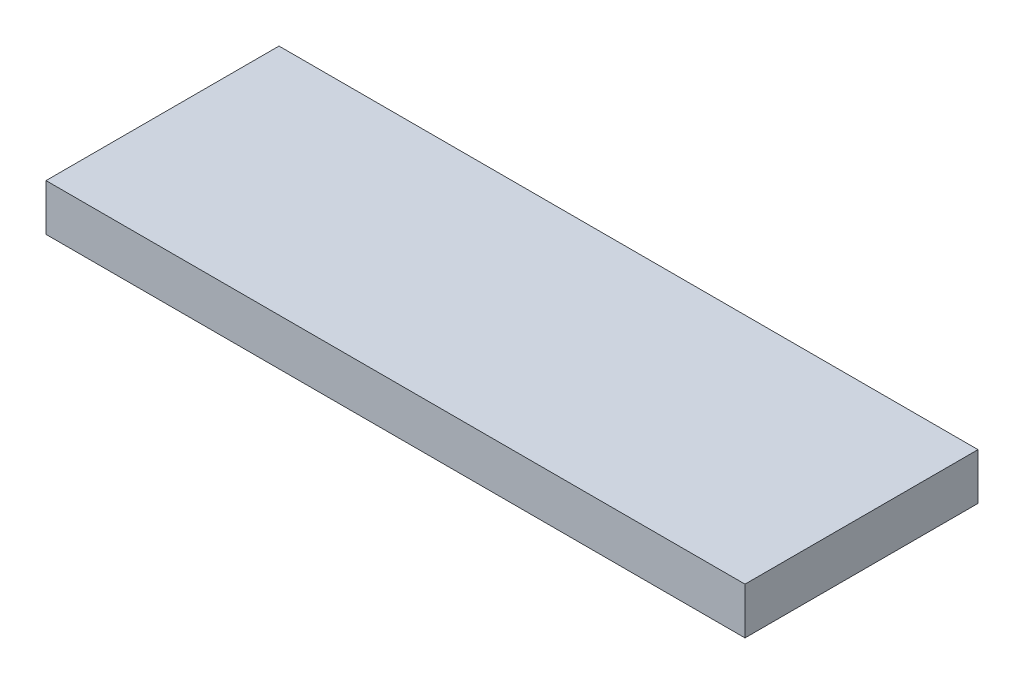
ISO-10303-21;
HEADER;
FILE_DESCRIPTION(('STEP AP214'),'2;1');
FILE_NAME('part.step','',(''),(''),'','','');
FILE_SCHEMA(('AUTOMOTIVE_DESIGN { 1 0 10303 214 1 1 1 1 }'));
ENDSEC;
DATA;
#1=APPLICATION_CONTEXT('core data for automotive mechanical design processes');
#2=APPLICATION_PROTOCOL_DEFINITION('international standard','automotive_design',2000,#1);
#3=PRODUCT_CONTEXT('',#1,'mechanical');
#4=PRODUCT('Part','Part','',(#3));
#5=PRODUCT_RELATED_PRODUCT_CATEGORY('part','',(#4));
#6=PRODUCT_DEFINITION_FORMATION('','',#4);
#7=PRODUCT_DEFINITION_CONTEXT('part definition',#1,'design');
#8=PRODUCT_DEFINITION('design','',#6,#7);
#9=PRODUCT_DEFINITION_SHAPE('','',#8);
#10=(LENGTH_UNIT() NAMED_UNIT(*) SI_UNIT(.MILLI.,.METRE.));
#11=(NAMED_UNIT(*) PLANE_ANGLE_UNIT() SI_UNIT($,.RADIAN.));
#12=(NAMED_UNIT(*) SI_UNIT($,.STERADIAN.) SOLID_ANGLE_UNIT());
#13=UNCERTAINTY_MEASURE_WITH_UNIT(LENGTH_MEASURE(1.E-05),#10,'distance_accuracy_value','');
#14=(GEOMETRIC_REPRESENTATION_CONTEXT(3) GLOBAL_UNCERTAINTY_ASSIGNED_CONTEXT((#13)) GLOBAL_UNIT_ASSIGNED_CONTEXT((#10,
#11,#12)) REPRESENTATION_CONTEXT('',''));
#15=CARTESIAN_POINT('',(0.,0.,0.));
#16=DIRECTION('',(0.,0.,1.));
#17=DIRECTION('',(1.,0.,0.));
#18=AXIS2_PLACEMENT_3D('',#15,#16,#17);
#19=CARTESIAN_POINT('',(-20.4230769230769,3.,-11.8269230769231));
#20=DIRECTION('',(1.,0.,0.));
#21=DIRECTION('',(0.,0.,-1.));
#22=AXIS2_PLACEMENT_3D('',#19,#20,#21);
#23=PLANE('',#22);
#24=DIRECTION('',(0.,0.,1.));
#25=VECTOR('',#24,1.);
#26=CARTESIAN_POINT('',(-20.4230769230769,0.,-11.8269230769231));
#27=LINE('',#26,#25);
#28=CARTESIAN_POINT('',(-20.4230769230769,0.,-11.8269230769231));
#29=VERTEX_POINT('',#28);
#30=CARTESIAN_POINT('',(-20.4230769230769,0.,3.17307692307693));
#31=VERTEX_POINT('',#30);
#32=EDGE_CURVE('E107',#29,#31,#27,.T.);
#33=ORIENTED_EDGE('',*,*,#32,.T.);
#34=DIRECTION('',(0.,-1.,0.));
#35=VECTOR('',#34,1.);
#36=CARTESIAN_POINT('',(-20.4230769230769,3.,3.17307692307693));
#37=LINE('',#36,#35);
#38=CARTESIAN_POINT('',(-20.4230769230769,3.,3.17307692307693));
#39=VERTEX_POINT('',#38);
#40=EDGE_CURVE('E11',#39,#31,#37,.T.);
#41=ORIENTED_EDGE('',*,*,#40,.F.);
#42=DIRECTION('',(0.,0.,1.));
#43=VECTOR('',#42,1.);
#44=CARTESIAN_POINT('',(-20.4230769230769,3.,-11.8269230769231));
#45=LINE('',#44,#43);
#46=CARTESIAN_POINT('',(-20.4230769230769,3.,-11.8269230769231));
#47=VERTEX_POINT('',#46);
#48=EDGE_CURVE('E91',#47,#39,#45,.T.);
#49=ORIENTED_EDGE('',*,*,#48,.F.);
#50=DIRECTION('',(0.,-1.,0.));
#51=VECTOR('',#50,1.);
#52=CARTESIAN_POINT('',(-20.4230769230769,3.,-11.8269230769231));
#53=LINE('',#52,#51);
#54=EDGE_CURVE('E103',#47,#29,#53,.T.);
#55=ORIENTED_EDGE('',*,*,#54,.T.);
#56=EDGE_LOOP('',(#33,#41,#49,#55));
#57=FACE_BOUND('',#56,.T.);
#58=ADVANCED_FACE('F39',(#57),#23,.F.);
#59=CARTESIAN_POINT('',(-20.4230769230769,3.,3.17307692307693));
#60=DIRECTION('',(0.,0.,-1.));
#61=DIRECTION('',(-1.,0.,0.));
#62=AXIS2_PLACEMENT_3D('',#59,#60,#61);
#63=PLANE('',#62);
#64=DIRECTION('',(1.,0.,0.));
#65=VECTOR('',#64,1.);
#66=CARTESIAN_POINT('',(-20.4230769230769,0.,3.17307692307693));
#67=LINE('',#66,#65);
#68=CARTESIAN_POINT('',(24.5769230769231,0.,3.17307692307693));
#69=VERTEX_POINT('',#68);
#70=EDGE_CURVE('E96',#31,#69,#67,.T.);
#71=ORIENTED_EDGE('',*,*,#70,.T.);
#72=DIRECTION('',(0.,-1.,0.));
#73=VECTOR('',#72,1.);
#74=CARTESIAN_POINT('',(24.5769230769231,3.,3.17307692307693));
#75=LINE('',#74,#73);
#76=CARTESIAN_POINT('',(24.5769230769231,3.,3.17307692307693));
#77=VERTEX_POINT('',#76);
#78=EDGE_CURVE('E48',#77,#69,#75,.T.);
#79=ORIENTED_EDGE('',*,*,#78,.F.);
#80=DIRECTION('',(1.,0.,0.));
#81=VECTOR('',#80,1.);
#82=CARTESIAN_POINT('',(-20.4230769230769,3.,3.17307692307693));
#83=LINE('',#82,#81);
#84=EDGE_CURVE('E86',#39,#77,#83,.T.);
#85=ORIENTED_EDGE('',*,*,#84,.F.);
#86=ORIENTED_EDGE('',*,*,#40,.T.);
#87=EDGE_LOOP('',(#71,#79,#85,#86));
#88=FACE_BOUND('',#87,.T.);
#89=ADVANCED_FACE('F95',(#88),#63,.F.);
#90=CARTESIAN_POINT('',(24.5769230769231,3.,-11.8269230769231));
#91=DIRECTION('',(-1.,0.,0.));
#92=DIRECTION('',(0.,0.,1.));
#93=AXIS2_PLACEMENT_3D('',#90,#91,#92);
#94=PLANE('',#93);
#95=DIRECTION('',(0.,0.,-1.));
#96=VECTOR('',#95,1.);
#97=CARTESIAN_POINT('',(24.5769230769231,0.,-11.8269230769231));
#98=LINE('',#97,#96);
#99=CARTESIAN_POINT('',(24.5769230769231,0.,-11.8269230769231));
#100=VERTEX_POINT('',#99);
#101=EDGE_CURVE('E73',#69,#100,#98,.T.);
#102=ORIENTED_EDGE('',*,*,#101,.T.);
#103=DIRECTION('',(0.,-1.,0.));
#104=VECTOR('',#103,1.);
#105=CARTESIAN_POINT('',(24.5769230769231,3.,-11.8269230769231));
#106=LINE('',#105,#104);
#107=CARTESIAN_POINT('',(24.5769230769231,3.,-11.8269230769231));
#108=VERTEX_POINT('',#107);
#109=EDGE_CURVE('E98',#108,#100,#106,.T.);
#110=ORIENTED_EDGE('',*,*,#109,.F.);
#111=DIRECTION('',(0.,0.,-1.));
#112=VECTOR('',#111,1.);
#113=CARTESIAN_POINT('',(24.5769230769231,3.,-11.8269230769231));
#114=LINE('',#113,#112);
#115=EDGE_CURVE('E89',#77,#108,#114,.T.);
#116=ORIENTED_EDGE('',*,*,#115,.F.);
#117=ORIENTED_EDGE('',*,*,#78,.T.);
#118=EDGE_LOOP('',(#102,#110,#116,#117));
#119=FACE_BOUND('',#118,.T.);
#120=ADVANCED_FACE('F99',(#119),#94,.F.);
#121=CARTESIAN_POINT('',(-20.4230769230769,3.,-11.8269230769231));
#122=DIRECTION('',(0.,0.,1.));
#123=DIRECTION('',(1.,0.,0.));
#124=AXIS2_PLACEMENT_3D('',#121,#122,#123);
#125=PLANE('',#124);
#126=DIRECTION('',(-1.,0.,0.));
#127=VECTOR('',#126,1.);
#128=CARTESIAN_POINT('',(-20.4230769230769,0.,-11.8269230769231));
#129=LINE('',#128,#127);
#130=EDGE_CURVE('E79',#100,#29,#129,.T.);
#131=ORIENTED_EDGE('',*,*,#130,.T.);
#132=ORIENTED_EDGE('',*,*,#54,.F.);
#133=DIRECTION('',(-1.,0.,0.));
#134=VECTOR('',#133,1.);
#135=CARTESIAN_POINT('',(-20.4230769230769,3.,-11.8269230769231));
#136=LINE('',#135,#134);
#137=EDGE_CURVE('E56',#108,#47,#136,.T.);
#138=ORIENTED_EDGE('',*,*,#137,.F.);
#139=ORIENTED_EDGE('',*,*,#109,.T.);
#140=EDGE_LOOP('',(#131,#132,#138,#139));
#141=FACE_BOUND('',#140,.T.);
#142=ADVANCED_FACE('F120',(#141),#125,.F.);
#143=CARTESIAN_POINT('',(0.,3.,0.));
#144=DIRECTION('',(0.,1.,0.));
#145=DIRECTION('',(0.,0.,1.));
#146=AXIS2_PLACEMENT_3D('',#143,#144,#145);
#147=PLANE('',#146);
#148=ORIENTED_EDGE('',*,*,#48,.T.);
#149=ORIENTED_EDGE('',*,*,#84,.T.);
#150=ORIENTED_EDGE('',*,*,#115,.T.);
#151=ORIENTED_EDGE('',*,*,#137,.T.);
#152=EDGE_LOOP('',(#148,#149,#150,#151));
#153=FACE_BOUND('',#152,.T.);
#154=ADVANCED_FACE('F87',(#153),#147,.T.);
#155=CARTESIAN_POINT('',(0.,0.,0.));
#156=DIRECTION('',(0.,1.,0.));
#157=DIRECTION('',(0.,0.,1.));
#158=AXIS2_PLACEMENT_3D('',#155,#156,#157);
#159=PLANE('',#158);
#160=ORIENTED_EDGE('',*,*,#32,.F.);
#161=ORIENTED_EDGE('',*,*,#130,.F.);
#162=ORIENTED_EDGE('',*,*,#101,.F.);
#163=ORIENTED_EDGE('',*,*,#70,.F.);
#164=EDGE_LOOP('',(#160,#161,#162,#163));
#165=FACE_BOUND('',#164,.T.);
#166=ADVANCED_FACE('F123',(#165),#159,.F.);
#167=CLOSED_SHELL('',(#58,#89,#120,#142,#154,#166));
#168=MANIFOLD_SOLID_BREP('B2',#167);
#169=ADVANCED_BREP_SHAPE_REPRESENTATION('',(#18,#168),#14);
#170=SHAPE_DEFINITION_REPRESENTATION(#9,#169);
ENDSEC;
END-ISO-10303-21;
